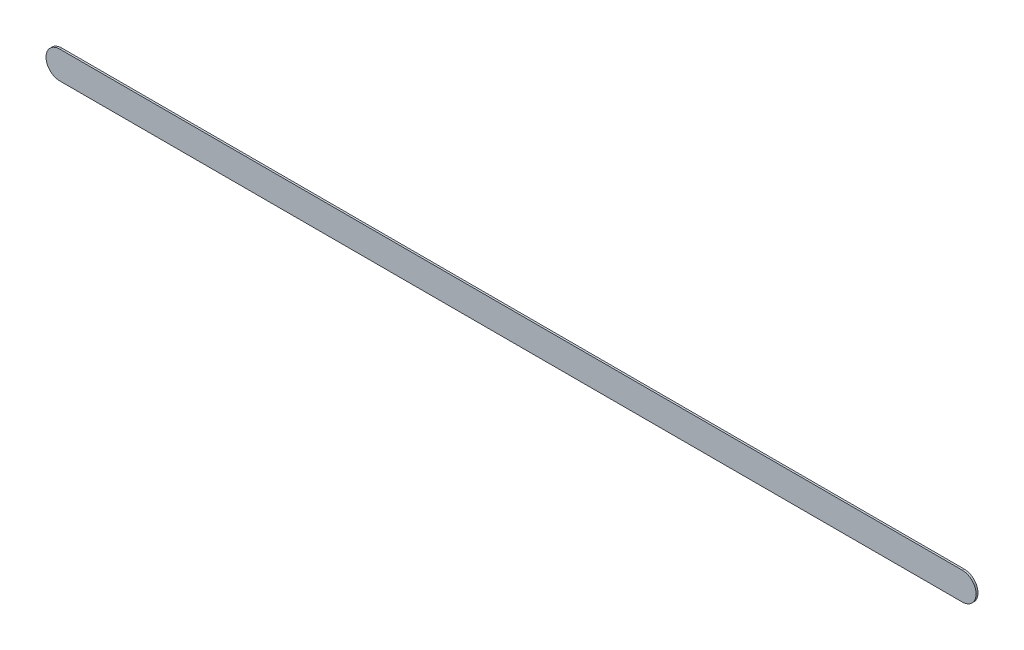
ISO-10303-21;
HEADER;
FILE_DESCRIPTION(('STEP AP214'),'2;1');
FILE_NAME('part.step','',(''),(''),'','','');
FILE_SCHEMA(('AUTOMOTIVE_DESIGN { 1 0 10303 214 1 1 1 1 }'));
ENDSEC;
DATA;
#1=APPLICATION_CONTEXT('core data for automotive mechanical design processes');
#2=APPLICATION_PROTOCOL_DEFINITION('international standard','automotive_design',2000,#1);
#3=PRODUCT_CONTEXT('',#1,'mechanical');
#4=PRODUCT('Part','Part','',(#3));
#5=PRODUCT_RELATED_PRODUCT_CATEGORY('part','',(#4));
#6=PRODUCT_DEFINITION_FORMATION('','',#4);
#7=PRODUCT_DEFINITION_CONTEXT('part definition',#1,'design');
#8=PRODUCT_DEFINITION('design','',#6,#7);
#9=PRODUCT_DEFINITION_SHAPE('','',#8);
#10=(LENGTH_UNIT() NAMED_UNIT(*) SI_UNIT(.MILLI.,.METRE.));
#11=(NAMED_UNIT(*) PLANE_ANGLE_UNIT() SI_UNIT($,.RADIAN.));
#12=(NAMED_UNIT(*) SI_UNIT($,.STERADIAN.) SOLID_ANGLE_UNIT());
#13=UNCERTAINTY_MEASURE_WITH_UNIT(LENGTH_MEASURE(1.E-05),#10,'distance_accuracy_value','');
#14=(GEOMETRIC_REPRESENTATION_CONTEXT(3) GLOBAL_UNCERTAINTY_ASSIGNED_CONTEXT((#13)) GLOBAL_UNIT_ASSIGNED_CONTEXT((#10,
#11,#12)) REPRESENTATION_CONTEXT('',''));
#15=CARTESIAN_POINT('',(0.,0.,0.));
#16=DIRECTION('',(0.,0.,1.));
#17=DIRECTION('',(1.,0.,0.));
#18=AXIS2_PLACEMENT_3D('',#15,#16,#17);
#19=CARTESIAN_POINT('',(107.84,-99.85,1.635));
#20=DIRECTION('',(0.,0.,1.));
#21=DIRECTION('',(1.,0.,0.));
#22=AXIS2_PLACEMENT_3D('',#19,#20,#21);
#23=PLANE('',#22);
#24=DIRECTION('',(1.,0.,0.));
#25=VECTOR('',#24,1.);
#26=CARTESIAN_POINT('',(107.84,-99.85,1.635));
#27=LINE('',#26,#25);
#28=CARTESIAN_POINT('',(107.84,-99.85,1.635));
#29=VERTEX_POINT('',#28);
#30=CARTESIAN_POINT('',(124.18,-99.85,1.635));
#31=VERTEX_POINT('',#30);
#32=EDGE_CURVE('E82',#29,#31,#27,.T.);
#33=ORIENTED_EDGE('',*,*,#32,.T.);
#34=CARTESIAN_POINT('',(124.18,-99.6,1.635));
#35=DIRECTION('',(0.,0.,1.));
#36=DIRECTION('',(0.,-1.,0.));
#37=AXIS2_PLACEMENT_3D('',#34,#35,#36);
#38=CIRCLE('',#37,0.25);
#39=CARTESIAN_POINT('',(124.18,-99.35,1.635));
#40=VERTEX_POINT('',#39);
#41=EDGE_CURVE('E108',#31,#40,#38,.T.);
#42=ORIENTED_EDGE('',*,*,#41,.T.);
#43=DIRECTION('',(-1.,0.,0.));
#44=VECTOR('',#43,1.);
#45=CARTESIAN_POINT('',(124.18,-99.35,1.635));
#46=LINE('',#45,#44);
#47=CARTESIAN_POINT('',(107.84,-99.35,1.635));
#48=VERTEX_POINT('',#47);
#49=EDGE_CURVE('E75',#40,#48,#46,.T.);
#50=ORIENTED_EDGE('',*,*,#49,.T.);
#51=CARTESIAN_POINT('',(107.84,-99.6,1.635));
#52=DIRECTION('',(0.,0.,1.));
#53=DIRECTION('',(0.,1.,0.));
#54=AXIS2_PLACEMENT_3D('',#51,#52,#53);
#55=CIRCLE('',#54,0.25);
#56=EDGE_CURVE('E11',#48,#29,#55,.T.);
#57=ORIENTED_EDGE('',*,*,#56,.T.);
#58=EDGE_LOOP('',(#33,#42,#50,#57));
#59=FACE_BOUND('',#58,.T.);
#60=ADVANCED_FACE('F17',(#59),#23,.T.);
#61=CARTESIAN_POINT('',(107.84,-99.85,1.6));
#62=DIRECTION('',(0.,0.,1.));
#63=DIRECTION('',(1.,0.,0.));
#64=AXIS2_PLACEMENT_3D('',#61,#62,#63);
#65=PLANE('',#64);
#66=CARTESIAN_POINT('',(107.84,-99.6,1.6));
#67=DIRECTION('',(0.,0.,1.));
#68=DIRECTION('',(0.,1.,0.));
#69=AXIS2_PLACEMENT_3D('',#66,#67,#68);
#70=CIRCLE('',#69,0.25);
#71=CARTESIAN_POINT('',(107.84,-99.35,1.6));
#72=VERTEX_POINT('',#71);
#73=CARTESIAN_POINT('',(107.84,-99.85,1.6));
#74=VERTEX_POINT('',#73);
#75=EDGE_CURVE('E20',#72,#74,#70,.T.);
#76=ORIENTED_EDGE('',*,*,#75,.F.);
#77=DIRECTION('',(-1.,0.,0.));
#78=VECTOR('',#77,1.);
#79=CARTESIAN_POINT('',(124.18,-99.35,1.6));
#80=LINE('',#79,#78);
#81=CARTESIAN_POINT('',(124.18,-99.35,1.6));
#82=VERTEX_POINT('',#81);
#83=EDGE_CURVE('E112',#82,#72,#80,.T.);
#84=ORIENTED_EDGE('',*,*,#83,.F.);
#85=CARTESIAN_POINT('',(124.18,-99.6,1.6));
#86=DIRECTION('',(0.,0.,1.));
#87=DIRECTION('',(0.,-1.,0.));
#88=AXIS2_PLACEMENT_3D('',#85,#86,#87);
#89=CIRCLE('',#88,0.25);
#90=CARTESIAN_POINT('',(124.18,-99.85,1.6));
#91=VERTEX_POINT('',#90);
#92=EDGE_CURVE('E84',#91,#82,#89,.T.);
#93=ORIENTED_EDGE('',*,*,#92,.F.);
#94=DIRECTION('',(1.,0.,0.));
#95=VECTOR('',#94,1.);
#96=CARTESIAN_POINT('',(107.84,-99.85,1.6));
#97=LINE('',#96,#95);
#98=EDGE_CURVE('E80',#74,#91,#97,.T.);
#99=ORIENTED_EDGE('',*,*,#98,.F.);
#100=EDGE_LOOP('',(#76,#84,#93,#99));
#101=FACE_BOUND('',#100,.T.);
#102=ADVANCED_FACE('F86',(#101),#65,.F.);
#103=CARTESIAN_POINT('',(107.84,-99.6,1.6));
#104=DIRECTION('',(0.,0.,-1.));
#105=DIRECTION('',(0.,1.,0.));
#106=AXIS2_PLACEMENT_3D('',#103,#104,#105);
#107=CYLINDRICAL_SURFACE('',#106,0.25);
#108=ORIENTED_EDGE('',*,*,#75,.T.);
#109=DIRECTION('',(0.,0.,1.));
#110=VECTOR('',#109,1.);
#111=CARTESIAN_POINT('',(107.84,-99.85,1.6));
#112=LINE('',#111,#110);
#113=EDGE_CURVE('E69',#74,#29,#112,.T.);
#114=ORIENTED_EDGE('',*,*,#113,.T.);
#115=ORIENTED_EDGE('',*,*,#56,.F.);
#116=DIRECTION('',(0.,0.,1.));
#117=VECTOR('',#116,1.);
#118=CARTESIAN_POINT('',(107.84,-99.35,1.6));
#119=LINE('',#118,#117);
#120=EDGE_CURVE('E72',#72,#48,#119,.T.);
#121=ORIENTED_EDGE('',*,*,#120,.F.);
#122=EDGE_LOOP('',(#108,#114,#115,#121));
#123=FACE_BOUND('',#122,.T.);
#124=ADVANCED_FACE('F68',(#123),#107,.T.);
#125=CARTESIAN_POINT('',(124.18,-99.35,1.6));
#126=DIRECTION('',(0.,-1.,0.));
#127=DIRECTION('',(0.,0.,-1.));
#128=AXIS2_PLACEMENT_3D('',#125,#126,#127);
#129=PLANE('',#128);
#130=ORIENTED_EDGE('',*,*,#83,.T.);
#131=ORIENTED_EDGE('',*,*,#120,.T.);
#132=ORIENTED_EDGE('',*,*,#49,.F.);
#133=DIRECTION('',(0.,0.,1.));
#134=VECTOR('',#133,1.);
#135=CARTESIAN_POINT('',(124.18,-99.35,1.6));
#136=LINE('',#135,#134);
#137=EDGE_CURVE('E104',#82,#40,#136,.T.);
#138=ORIENTED_EDGE('',*,*,#137,.F.);
#139=EDGE_LOOP('',(#130,#131,#132,#138));
#140=FACE_BOUND('',#139,.T.);
#141=ADVANCED_FACE('F118',(#140),#129,.F.);
#142=CARTESIAN_POINT('',(124.18,-99.6,1.6));
#143=DIRECTION('',(0.,0.,-1.));
#144=DIRECTION('',(0.,-1.,0.));
#145=AXIS2_PLACEMENT_3D('',#142,#143,#144);
#146=CYLINDRICAL_SURFACE('',#145,0.25);
#147=ORIENTED_EDGE('',*,*,#92,.T.);
#148=ORIENTED_EDGE('',*,*,#137,.T.);
#149=ORIENTED_EDGE('',*,*,#41,.F.);
#150=DIRECTION('',(0.,0.,1.));
#151=VECTOR('',#150,1.);
#152=CARTESIAN_POINT('',(124.18,-99.85,1.6));
#153=LINE('',#152,#151);
#154=EDGE_CURVE('E90',#91,#31,#153,.T.);
#155=ORIENTED_EDGE('',*,*,#154,.F.);
#156=EDGE_LOOP('',(#147,#148,#149,#155));
#157=FACE_BOUND('',#156,.T.);
#158=ADVANCED_FACE('F121',(#157),#146,.T.);
#159=CARTESIAN_POINT('',(107.84,-99.85,1.6));
#160=DIRECTION('',(0.,1.,0.));
#161=DIRECTION('',(1.,0.,0.));
#162=AXIS2_PLACEMENT_3D('',#159,#160,#161);
#163=PLANE('',#162);
#164=ORIENTED_EDGE('',*,*,#98,.T.);
#165=ORIENTED_EDGE('',*,*,#154,.T.);
#166=ORIENTED_EDGE('',*,*,#32,.F.);
#167=ORIENTED_EDGE('',*,*,#113,.F.);
#168=EDGE_LOOP('',(#164,#165,#166,#167));
#169=FACE_BOUND('',#168,.T.);
#170=ADVANCED_FACE('F78',(#169),#163,.F.);
#171=CLOSED_SHELL('',(#60,#102,#124,#141,#158,#170));
#172=MANIFOLD_SOLID_BREP('B1',#171);
#173=ADVANCED_BREP_SHAPE_REPRESENTATION('',(#18,#172),#14);
#174=SHAPE_DEFINITION_REPRESENTATION(#9,#173);
ENDSEC;
END-ISO-10303-21;
